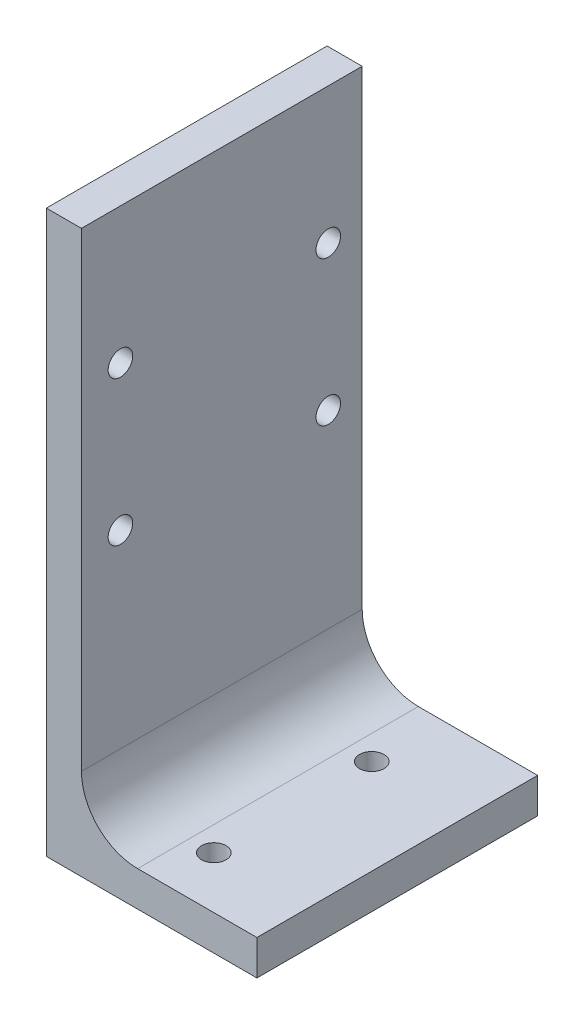
ISO-10303-21;
HEADER;
FILE_DESCRIPTION(('STEP AP214'),'2;1');
FILE_NAME('part.step','',(''),(''),'','','');
FILE_SCHEMA(('AUTOMOTIVE_DESIGN { 1 0 10303 214 1 1 1 1 }'));
ENDSEC;
DATA;
#1=APPLICATION_CONTEXT('core data for automotive mechanical design processes');
#2=APPLICATION_PROTOCOL_DEFINITION('international standard','automotive_design',2000,#1);
#3=PRODUCT_CONTEXT('',#1,'mechanical');
#4=PRODUCT('Part','Part','',(#3));
#5=PRODUCT_RELATED_PRODUCT_CATEGORY('part','',(#4));
#6=PRODUCT_DEFINITION_FORMATION('','',#4);
#7=PRODUCT_DEFINITION_CONTEXT('part definition',#1,'design');
#8=PRODUCT_DEFINITION('design','',#6,#7);
#9=PRODUCT_DEFINITION_SHAPE('','',#8);
#10=(LENGTH_UNIT() NAMED_UNIT(*) SI_UNIT(.MILLI.,.METRE.));
#11=(NAMED_UNIT(*) PLANE_ANGLE_UNIT() SI_UNIT($,.RADIAN.));
#12=(NAMED_UNIT(*) SI_UNIT($,.STERADIAN.) SOLID_ANGLE_UNIT());
#13=UNCERTAINTY_MEASURE_WITH_UNIT(LENGTH_MEASURE(1.E-05),#10,'distance_accuracy_value','');
#14=(GEOMETRIC_REPRESENTATION_CONTEXT(3) GLOBAL_UNCERTAINTY_ASSIGNED_CONTEXT((#13)) GLOBAL_UNIT_ASSIGNED_CONTEXT((#10,
#11,#12)) REPRESENTATION_CONTEXT('',''));
#15=CARTESIAN_POINT('',(0.,0.,0.));
#16=DIRECTION('',(0.,0.,1.));
#17=DIRECTION('',(1.,0.,0.));
#18=AXIS2_PLACEMENT_3D('',#15,#16,#17);
#19=CARTESIAN_POINT('',(0.,-34.9738219895288,40.));
#20=DIRECTION('',(0.,-1.,0.));
#21=DIRECTION('',(0.,0.,-1.));
#22=AXIS2_PLACEMENT_3D('',#19,#20,#21);
#23=PLANE('',#22);
#24=CARTESIAN_POINT('',(-13.5290293124797,-34.9738219895288,32.612904953595));
#25=DIRECTION('',(0.,1.,0.));
#26=DIRECTION('',(0.,0.,1.));
#27=AXIS2_PLACEMENT_3D('',#24,#25,#26);
#28=CIRCLE('',#27,1.74999999999999);
#29=CARTESIAN_POINT('',(-13.5290293124797,-34.9738219895288,34.362904953595));
#30=VERTEX_POINT('',#29);
#31=EDGE_CURVE('E173',#30,#30,#28,.T.);
#32=ORIENTED_EDGE('',*,*,#31,.F.);
#33=EDGE_LOOP('',(#32));
#34=FACE_BOUND('',#33,.T.);
#35=CARTESIAN_POINT('',(-13.5290293124797,-34.9738219895288,10.1107689095841));
#36=DIRECTION('',(0.,1.,0.));
#37=DIRECTION('',(0.,0.,1.));
#38=AXIS2_PLACEMENT_3D('',#35,#36,#37);
#39=CIRCLE('',#38,1.74999999999999);
#40=CARTESIAN_POINT('',(-13.5290293124797,-34.9738219895288,11.8607689095841));
#41=VERTEX_POINT('',#40);
#42=EDGE_CURVE('E167',#41,#41,#39,.T.);
#43=ORIENTED_EDGE('',*,*,#42,.F.);
#44=EDGE_LOOP('',(#43));
#45=FACE_BOUND('',#44,.T.);
#46=DIRECTION('',(-1.,0.,0.));
#47=VECTOR('',#46,1.);
#48=CARTESIAN_POINT('',(0.,-34.9738219895288,0.));
#49=LINE('',#48,#47);
#50=CARTESIAN_POINT('',(0.,-34.9738219895288,0.));
#51=VERTEX_POINT('',#50);
#52=CARTESIAN_POINT('',(-17.,-34.9738219895288,0.));
#53=VERTEX_POINT('',#52);
#54=EDGE_CURVE('E126',#51,#53,#49,.T.);
#55=ORIENTED_EDGE('',*,*,#54,.T.);
#56=DIRECTION('',(0.,0.,-1.));
#57=VECTOR('',#56,1.);
#58=CARTESIAN_POINT('',(-17.,-34.9738219895288,40.));
#59=LINE('',#58,#57);
#60=CARTESIAN_POINT('',(-17.,-34.9738219895288,40.));
#61=VERTEX_POINT('',#60);
#62=EDGE_CURVE('E49',#53,#61,#59,.F.);
#63=ORIENTED_EDGE('',*,*,#62,.T.);
#64=DIRECTION('',(-1.,0.,0.));
#65=VECTOR('',#64,1.);
#66=CARTESIAN_POINT('',(0.,-34.9738219895288,40.));
#67=LINE('',#66,#65);
#68=CARTESIAN_POINT('',(0.,-34.9738219895288,40.));
#69=VERTEX_POINT('',#68);
#70=EDGE_CURVE('E102',#69,#61,#67,.T.);
#71=ORIENTED_EDGE('',*,*,#70,.F.);
#72=DIRECTION('',(0.,0.,-1.));
#73=VECTOR('',#72,1.);
#74=CARTESIAN_POINT('',(0.,-34.9738219895288,40.));
#75=LINE('',#74,#73);
#76=EDGE_CURVE('E125',#69,#51,#75,.T.);
#77=ORIENTED_EDGE('',*,*,#76,.T.);
#78=EDGE_LOOP('',(#55,#63,#71,#77));
#79=FACE_BOUND('',#78,.T.);
#80=ADVANCED_FACE('F34',(#34,#45,#79),#23,.F.);
#81=CARTESIAN_POINT('',(-25.,-34.9738219895288,40.));
#82=DIRECTION('',(-1.,0.,0.));
#83=DIRECTION('',(0.,-1.,0.));
#84=AXIS2_PLACEMENT_3D('',#81,#82,#83);
#85=PLANE('',#84);
#86=CARTESIAN_POINT('',(-25.,20.6350968374664,4.83204436713791));
#87=DIRECTION('',(-1.,0.,0.));
#88=DIRECTION('',(0.,-1.,0.));
#89=AXIS2_PLACEMENT_3D('',#86,#87,#88);
#90=CIRCLE('',#89,1.74999999999999);
#91=CARTESIAN_POINT('',(-25.,18.8850968374665,4.83204436713791));
#92=VERTEX_POINT('',#91);
#93=EDGE_CURVE('E194',#92,#92,#90,.T.);
#94=ORIENTED_EDGE('',*,*,#93,.T.);
#95=EDGE_LOOP('',(#94));
#96=FACE_BOUND('',#95,.T.);
#97=CARTESIAN_POINT('',(-25.,20.6350968374664,34.443923192736));
#98=DIRECTION('',(-1.,0.,0.));
#99=DIRECTION('',(0.,-1.,0.));
#100=AXIS2_PLACEMENT_3D('',#97,#98,#99);
#101=CIRCLE('',#100,1.74999999999999);
#102=CARTESIAN_POINT('',(-25.,18.8850968374665,34.443923192736));
#103=VERTEX_POINT('',#102);
#104=EDGE_CURVE('E188',#103,#103,#101,.T.);
#105=ORIENTED_EDGE('',*,*,#104,.T.);
#106=EDGE_LOOP('',(#105));
#107=FACE_BOUND('',#106,.T.);
#108=CARTESIAN_POINT('',(-25.,0.,34.443923192736));
#109=DIRECTION('',(-1.,0.,0.));
#110=DIRECTION('',(0.,-1.,0.));
#111=AXIS2_PLACEMENT_3D('',#108,#109,#110);
#112=CIRCLE('',#111,1.74999999999999);
#113=CARTESIAN_POINT('',(-25.,-1.74999999999999,34.443923192736));
#114=VERTEX_POINT('',#113);
#115=EDGE_CURVE('E182',#114,#114,#112,.T.);
#116=ORIENTED_EDGE('',*,*,#115,.T.);
#117=EDGE_LOOP('',(#116));
#118=FACE_BOUND('',#117,.T.);
#119=CARTESIAN_POINT('',(-25.,0.,4.83204436713791));
#120=DIRECTION('',(-1.,0.,0.));
#121=DIRECTION('',(0.,-1.,0.));
#122=AXIS2_PLACEMENT_3D('',#119,#120,#121);
#123=CIRCLE('',#122,1.74999999999999);
#124=CARTESIAN_POINT('',(-25.,-1.74999999999999,4.83204436713791));
#125=VERTEX_POINT('',#124);
#126=EDGE_CURVE('E176',#125,#125,#123,.T.);
#127=ORIENTED_EDGE('',*,*,#126,.T.);
#128=EDGE_LOOP('',(#127));
#129=FACE_BOUND('',#128,.T.);
#130=DIRECTION('',(0.,1.,0.));
#131=VECTOR('',#130,1.);
#132=CARTESIAN_POINT('',(-25.,-34.9738219895288,40.));
#133=LINE('',#132,#131);
#134=CARTESIAN_POINT('',(-25.,-26.9738219895288,40.));
#135=VERTEX_POINT('',#134);
#136=CARTESIAN_POINT('',(-25.,40.0261780104712,40.));
#137=VERTEX_POINT('',#136);
#138=EDGE_CURVE('E92',#135,#137,#133,.T.);
#139=ORIENTED_EDGE('',*,*,#138,.F.);
#140=DIRECTION('',(0.,0.,-1.));
#141=VECTOR('',#140,1.);
#142=CARTESIAN_POINT('',(-25.,-26.9738219895288,0.));
#143=LINE('',#142,#141);
#144=CARTESIAN_POINT('',(-25.,-26.9738219895288,0.));
#145=VERTEX_POINT('',#144);
#146=EDGE_CURVE('E110',#135,#145,#143,.T.);
#147=ORIENTED_EDGE('',*,*,#146,.T.);
#148=DIRECTION('',(0.,1.,0.));
#149=VECTOR('',#148,1.);
#150=CARTESIAN_POINT('',(-25.,-34.9738219895288,0.));
#151=LINE('',#150,#149);
#152=CARTESIAN_POINT('',(-25.,40.0261780104712,0.));
#153=VERTEX_POINT('',#152);
#154=EDGE_CURVE('E107',#145,#153,#151,.T.);
#155=ORIENTED_EDGE('',*,*,#154,.T.);
#156=DIRECTION('',(0.,0.,-1.));
#157=VECTOR('',#156,1.);
#158=CARTESIAN_POINT('',(-25.,40.0261780104712,40.));
#159=LINE('',#158,#157);
#160=EDGE_CURVE('E105',#137,#153,#159,.T.);
#161=ORIENTED_EDGE('',*,*,#160,.F.);
#162=EDGE_LOOP('',(#139,#147,#155,#161));
#163=FACE_BOUND('',#162,.T.);
#164=ADVANCED_FACE('F106',(#96,#107,#118,#129,#163),#85,.F.);
#165=CARTESIAN_POINT('',(-25.,40.0261780104712,40.));
#166=DIRECTION('',(0.,-1.,0.));
#167=DIRECTION('',(0.,0.,-1.));
#168=AXIS2_PLACEMENT_3D('',#165,#166,#167);
#169=PLANE('',#168);
#170=DIRECTION('',(-1.,0.,0.));
#171=VECTOR('',#170,1.);
#172=CARTESIAN_POINT('',(-25.,40.0261780104712,0.));
#173=LINE('',#172,#171);
#174=CARTESIAN_POINT('',(-30.,40.0261780104712,0.));
#175=VERTEX_POINT('',#174);
#176=EDGE_CURVE('E130',#153,#175,#173,.T.);
#177=ORIENTED_EDGE('',*,*,#176,.T.);
#178=DIRECTION('',(0.,0.,-1.));
#179=VECTOR('',#178,1.);
#180=CARTESIAN_POINT('',(-30.,40.0261780104712,40.));
#181=LINE('',#180,#179);
#182=CARTESIAN_POINT('',(-30.,40.0261780104712,40.));
#183=VERTEX_POINT('',#182);
#184=EDGE_CURVE('E111',#183,#175,#181,.T.);
#185=ORIENTED_EDGE('',*,*,#184,.F.);
#186=DIRECTION('',(-1.,0.,0.));
#187=VECTOR('',#186,1.);
#188=CARTESIAN_POINT('',(-25.,40.0261780104712,40.));
#189=LINE('',#188,#187);
#190=EDGE_CURVE('E96',#137,#183,#189,.T.);
#191=ORIENTED_EDGE('',*,*,#190,.F.);
#192=ORIENTED_EDGE('',*,*,#160,.T.);
#193=EDGE_LOOP('',(#177,#185,#191,#192));
#194=FACE_BOUND('',#193,.T.);
#195=ADVANCED_FACE('F113',(#194),#169,.F.);
#196=CARTESIAN_POINT('',(-30.,40.0261780104712,40.));
#197=DIRECTION('',(1.,0.,0.));
#198=DIRECTION('',(0.,1.,0.));
#199=AXIS2_PLACEMENT_3D('',#196,#197,#198);
#200=PLANE('',#199);
#201=CARTESIAN_POINT('',(-30.,20.6350968374664,4.83204436713791));
#202=DIRECTION('',(-1.,0.,0.));
#203=DIRECTION('',(0.,0.,1.));
#204=AXIS2_PLACEMENT_3D('',#201,#202,#203);
#205=CIRCLE('',#204,1.74999999999999);
#206=CARTESIAN_POINT('',(-30.,20.6350968374664,6.5820443671379));
#207=VERTEX_POINT('',#206);
#208=EDGE_CURVE('E197',#207,#207,#205,.T.);
#209=ORIENTED_EDGE('',*,*,#208,.F.);
#210=EDGE_LOOP('',(#209));
#211=FACE_BOUND('',#210,.T.);
#212=CARTESIAN_POINT('',(-30.,20.6350968374664,34.443923192736));
#213=DIRECTION('',(-1.,0.,0.));
#214=DIRECTION('',(0.,0.,1.));
#215=AXIS2_PLACEMENT_3D('',#212,#213,#214);
#216=CIRCLE('',#215,1.74999999999999);
#217=CARTESIAN_POINT('',(-30.,20.6350968374664,36.193923192736));
#218=VERTEX_POINT('',#217);
#219=EDGE_CURVE('E191',#218,#218,#216,.T.);
#220=ORIENTED_EDGE('',*,*,#219,.F.);
#221=EDGE_LOOP('',(#220));
#222=FACE_BOUND('',#221,.T.);
#223=CARTESIAN_POINT('',(-30.,0.,34.443923192736));
#224=DIRECTION('',(-1.,0.,0.));
#225=DIRECTION('',(0.,0.,1.));
#226=AXIS2_PLACEMENT_3D('',#223,#224,#225);
#227=CIRCLE('',#226,1.74999999999999);
#228=CARTESIAN_POINT('',(-30.,0.,36.193923192736));
#229=VERTEX_POINT('',#228);
#230=EDGE_CURVE('E185',#229,#229,#227,.T.);
#231=ORIENTED_EDGE('',*,*,#230,.F.);
#232=EDGE_LOOP('',(#231));
#233=FACE_BOUND('',#232,.T.);
#234=CARTESIAN_POINT('',(-30.,0.,4.83204436713791));
#235=DIRECTION('',(-1.,0.,0.));
#236=DIRECTION('',(0.,0.,1.));
#237=AXIS2_PLACEMENT_3D('',#234,#235,#236);
#238=CIRCLE('',#237,1.74999999999999);
#239=CARTESIAN_POINT('',(-30.,0.,6.5820443671379));
#240=VERTEX_POINT('',#239);
#241=EDGE_CURVE('E179',#240,#240,#238,.T.);
#242=ORIENTED_EDGE('',*,*,#241,.F.);
#243=EDGE_LOOP('',(#242));
#244=FACE_BOUND('',#243,.T.);
#245=DIRECTION('',(0.,-1.,0.));
#246=VECTOR('',#245,1.);
#247=CARTESIAN_POINT('',(-30.,40.0261780104712,0.));
#248=LINE('',#247,#246);
#249=CARTESIAN_POINT('',(-30.,-39.9738219895288,0.));
#250=VERTEX_POINT('',#249);
#251=EDGE_CURVE('E132',#175,#250,#248,.T.);
#252=ORIENTED_EDGE('',*,*,#251,.T.);
#253=DIRECTION('',(0.,0.,-1.));
#254=VECTOR('',#253,1.);
#255=CARTESIAN_POINT('',(-30.,-39.9738219895288,40.));
#256=LINE('',#255,#254);
#257=CARTESIAN_POINT('',(-30.,-39.9738219895288,40.));
#258=VERTEX_POINT('',#257);
#259=EDGE_CURVE('E143',#258,#250,#256,.T.);
#260=ORIENTED_EDGE('',*,*,#259,.F.);
#261=DIRECTION('',(0.,-1.,0.));
#262=VECTOR('',#261,1.);
#263=CARTESIAN_POINT('',(-30.,40.0261780104712,40.));
#264=LINE('',#263,#262);
#265=EDGE_CURVE('E116',#183,#258,#264,.T.);
#266=ORIENTED_EDGE('',*,*,#265,.F.);
#267=ORIENTED_EDGE('',*,*,#184,.T.);
#268=EDGE_LOOP('',(#252,#260,#266,#267));
#269=FACE_BOUND('',#268,.T.);
#270=ADVANCED_FACE('F153',(#211,#222,#233,#244,#269),#200,.F.);
#271=CARTESIAN_POINT('',(-30.,-39.9738219895288,40.));
#272=DIRECTION('',(0.,1.,0.));
#273=DIRECTION('',(0.,0.,1.));
#274=AXIS2_PLACEMENT_3D('',#271,#272,#273);
#275=PLANE('',#274);
#276=CARTESIAN_POINT('',(-13.5290293124797,-39.9738219895288,32.612904953595));
#277=DIRECTION('',(0.,1.,0.));
#278=DIRECTION('',(0.,0.,1.));
#279=AXIS2_PLACEMENT_3D('',#276,#277,#278);
#280=CIRCLE('',#279,1.74999999999999);
#281=CARTESIAN_POINT('',(-13.5290293124797,-39.9738219895288,34.362904953595));
#282=VERTEX_POINT('',#281);
#283=EDGE_CURVE('E170',#282,#282,#280,.T.);
#284=ORIENTED_EDGE('',*,*,#283,.T.);
#285=EDGE_LOOP('',(#284));
#286=FACE_BOUND('',#285,.T.);
#287=CARTESIAN_POINT('',(-13.5290293124797,-39.9738219895288,10.1107689095841));
#288=DIRECTION('',(0.,1.,0.));
#289=DIRECTION('',(0.,0.,1.));
#290=AXIS2_PLACEMENT_3D('',#287,#288,#289);
#291=CIRCLE('',#290,1.74999999999999);
#292=CARTESIAN_POINT('',(-13.5290293124797,-39.9738219895288,11.8607689095841));
#293=VERTEX_POINT('',#292);
#294=EDGE_CURVE('E128',#293,#293,#291,.T.);
#295=ORIENTED_EDGE('',*,*,#294,.T.);
#296=EDGE_LOOP('',(#295));
#297=FACE_BOUND('',#296,.T.);
#298=DIRECTION('',(1.,0.,0.));
#299=VECTOR('',#298,1.);
#300=CARTESIAN_POINT('',(-30.,-39.9738219895288,0.));
#301=LINE('',#300,#299);
#302=CARTESIAN_POINT('',(0.,-39.9738219895288,0.));
#303=VERTEX_POINT('',#302);
#304=EDGE_CURVE('E134',#250,#303,#301,.T.);
#305=ORIENTED_EDGE('',*,*,#304,.T.);
#306=DIRECTION('',(0.,0.,-1.));
#307=VECTOR('',#306,1.);
#308=CARTESIAN_POINT('',(0.,-39.9738219895288,40.));
#309=LINE('',#308,#307);
#310=CARTESIAN_POINT('',(0.,-39.9738219895288,40.));
#311=VERTEX_POINT('',#310);
#312=EDGE_CURVE('E140',#311,#303,#309,.T.);
#313=ORIENTED_EDGE('',*,*,#312,.F.);
#314=DIRECTION('',(1.,0.,0.));
#315=VECTOR('',#314,1.);
#316=CARTESIAN_POINT('',(-30.,-39.9738219895288,40.));
#317=LINE('',#316,#315);
#318=EDGE_CURVE('E118',#258,#311,#317,.T.);
#319=ORIENTED_EDGE('',*,*,#318,.F.);
#320=ORIENTED_EDGE('',*,*,#259,.T.);
#321=EDGE_LOOP('',(#305,#313,#319,#320));
#322=FACE_BOUND('',#321,.T.);
#323=ADVANCED_FACE('F160',(#286,#297,#322),#275,.F.);
#324=CARTESIAN_POINT('',(0.,-39.9738219895288,40.));
#325=DIRECTION('',(-1.,0.,0.));
#326=DIRECTION('',(0.,0.,1.));
#327=AXIS2_PLACEMENT_3D('',#324,#325,#326);
#328=PLANE('',#327);
#329=DIRECTION('',(0.,1.,0.));
#330=VECTOR('',#329,1.);
#331=CARTESIAN_POINT('',(0.,-39.9738219895288,0.));
#332=LINE('',#331,#330);
#333=EDGE_CURVE('E136',#303,#51,#332,.T.);
#334=ORIENTED_EDGE('',*,*,#333,.T.);
#335=ORIENTED_EDGE('',*,*,#76,.F.);
#336=DIRECTION('',(0.,1.,0.));
#337=VECTOR('',#336,1.);
#338=CARTESIAN_POINT('',(0.,-39.9738219895288,40.));
#339=LINE('',#338,#337);
#340=EDGE_CURVE('E123',#311,#69,#339,.T.);
#341=ORIENTED_EDGE('',*,*,#340,.F.);
#342=ORIENTED_EDGE('',*,*,#312,.T.);
#343=EDGE_LOOP('',(#334,#335,#341,#342));
#344=FACE_BOUND('',#343,.T.);
#345=ADVANCED_FACE('F163',(#344),#328,.F.);
#346=CARTESIAN_POINT('',(0.,0.,40.));
#347=DIRECTION('',(0.,0.,-1.));
#348=DIRECTION('',(-1.,0.,0.));
#349=AXIS2_PLACEMENT_3D('',#346,#347,#348);
#350=PLANE('',#349);
#351=ORIENTED_EDGE('',*,*,#70,.T.);
#352=CARTESIAN_POINT('',(-17.,-26.9738219895288,40.));
#353=DIRECTION('',(0.,0.,-1.));
#354=DIRECTION('',(-1.,0.,0.));
#355=AXIS2_PLACEMENT_3D('',#352,#353,#354);
#356=CIRCLE('',#355,8.);
#357=EDGE_CURVE('E11',#61,#135,#356,.T.);
#358=ORIENTED_EDGE('',*,*,#357,.T.);
#359=ORIENTED_EDGE('',*,*,#138,.T.);
#360=ORIENTED_EDGE('',*,*,#190,.T.);
#361=ORIENTED_EDGE('',*,*,#265,.T.);
#362=ORIENTED_EDGE('',*,*,#318,.T.);
#363=ORIENTED_EDGE('',*,*,#340,.T.);
#364=EDGE_LOOP('',(#351,#358,#359,#360,#361,#362,#363));
#365=FACE_BOUND('',#364,.T.);
#366=ADVANCED_FACE('F94',(#365),#350,.F.);
#367=CARTESIAN_POINT('',(0.,0.,0.));
#368=DIRECTION('',(0.,0.,-1.));
#369=DIRECTION('',(-1.,0.,0.));
#370=AXIS2_PLACEMENT_3D('',#367,#368,#369);
#371=PLANE('',#370);
#372=ORIENTED_EDGE('',*,*,#54,.F.);
#373=ORIENTED_EDGE('',*,*,#333,.F.);
#374=ORIENTED_EDGE('',*,*,#304,.F.);
#375=ORIENTED_EDGE('',*,*,#251,.F.);
#376=ORIENTED_EDGE('',*,*,#176,.F.);
#377=ORIENTED_EDGE('',*,*,#154,.F.);
#378=CARTESIAN_POINT('',(-17.,-26.9738219895288,0.));
#379=DIRECTION('',(0.,0.,-1.));
#380=DIRECTION('',(-1.,0.,0.));
#381=AXIS2_PLACEMENT_3D('',#378,#379,#380);
#382=CIRCLE('',#381,8.);
#383=EDGE_CURVE('E42',#145,#53,#382,.F.);
#384=ORIENTED_EDGE('',*,*,#383,.T.);
#385=EDGE_LOOP('',(#372,#373,#374,#375,#376,#377,#384));
#386=FACE_BOUND('',#385,.T.);
#387=ADVANCED_FACE('F149',(#386),#371,.T.);
#388=CARTESIAN_POINT('',(-13.5290293124797,-34.9738219895288,10.1107689095841));
#389=DIRECTION('',(0.,1.,0.));
#390=DIRECTION('',(0.,0.,1.));
#391=AXIS2_PLACEMENT_3D('',#388,#389,#390);
#392=CYLINDRICAL_SURFACE('',#391,1.74999999999999);
#393=ORIENTED_EDGE('',*,*,#42,.T.);
#394=EDGE_LOOP('',(#393));
#395=FACE_BOUND('',#394,.T.);
#396=ORIENTED_EDGE('',*,*,#294,.F.);
#397=EDGE_LOOP('',(#396));
#398=FACE_BOUND('',#397,.T.);
#399=ADVANCED_FACE('F239',(#395,#398),#392,.F.);
#400=CARTESIAN_POINT('',(-13.5290293124797,-34.9738219895288,32.612904953595));
#401=DIRECTION('',(0.,1.,0.));
#402=DIRECTION('',(0.,0.,1.));
#403=AXIS2_PLACEMENT_3D('',#400,#401,#402);
#404=CYLINDRICAL_SURFACE('',#403,1.74999999999999);
#405=ORIENTED_EDGE('',*,*,#31,.T.);
#406=EDGE_LOOP('',(#405));
#407=FACE_BOUND('',#406,.T.);
#408=ORIENTED_EDGE('',*,*,#283,.F.);
#409=EDGE_LOOP('',(#408));
#410=FACE_BOUND('',#409,.T.);
#411=ADVANCED_FACE('F217',(#407,#410),#404,.F.);
#412=CARTESIAN_POINT('',(-30.,0.,4.83204436713791));
#413=DIRECTION('',(-1.,0.,0.));
#414=DIRECTION('',(0.,0.,1.));
#415=AXIS2_PLACEMENT_3D('',#412,#413,#414);
#416=CYLINDRICAL_SURFACE('',#415,1.74999999999999);
#417=ORIENTED_EDGE('',*,*,#241,.T.);
#418=EDGE_LOOP('',(#417));
#419=FACE_BOUND('',#418,.T.);
#420=ORIENTED_EDGE('',*,*,#126,.F.);
#421=EDGE_LOOP('',(#420));
#422=FACE_BOUND('',#421,.T.);
#423=ADVANCED_FACE('F213',(#419,#422),#416,.F.);
#424=CARTESIAN_POINT('',(-30.,0.,34.443923192736));
#425=DIRECTION('',(-1.,0.,0.));
#426=DIRECTION('',(0.,0.,1.));
#427=AXIS2_PLACEMENT_3D('',#424,#425,#426);
#428=CYLINDRICAL_SURFACE('',#427,1.74999999999999);
#429=ORIENTED_EDGE('',*,*,#230,.T.);
#430=EDGE_LOOP('',(#429));
#431=FACE_BOUND('',#430,.T.);
#432=ORIENTED_EDGE('',*,*,#115,.F.);
#433=EDGE_LOOP('',(#432));
#434=FACE_BOUND('',#433,.T.);
#435=ADVANCED_FACE('F216',(#431,#434),#428,.F.);
#436=CARTESIAN_POINT('',(-30.,20.6350968374664,34.443923192736));
#437=DIRECTION('',(-1.,0.,0.));
#438=DIRECTION('',(0.,0.,1.));
#439=AXIS2_PLACEMENT_3D('',#436,#437,#438);
#440=CYLINDRICAL_SURFACE('',#439,1.74999999999999);
#441=ORIENTED_EDGE('',*,*,#219,.T.);
#442=EDGE_LOOP('',(#441));
#443=FACE_BOUND('',#442,.T.);
#444=ORIENTED_EDGE('',*,*,#104,.F.);
#445=EDGE_LOOP('',(#444));
#446=FACE_BOUND('',#445,.T.);
#447=ADVANCED_FACE('F250',(#443,#446),#440,.F.);
#448=CARTESIAN_POINT('',(-30.,20.6350968374664,4.83204436713791));
#449=DIRECTION('',(-1.,0.,0.));
#450=DIRECTION('',(0.,0.,1.));
#451=AXIS2_PLACEMENT_3D('',#448,#449,#450);
#452=CYLINDRICAL_SURFACE('',#451,1.74999999999999);
#453=ORIENTED_EDGE('',*,*,#208,.T.);
#454=EDGE_LOOP('',(#453));
#455=FACE_BOUND('',#454,.T.);
#456=ORIENTED_EDGE('',*,*,#93,.F.);
#457=EDGE_LOOP('',(#456));
#458=FACE_BOUND('',#457,.T.);
#459=ADVANCED_FACE('F201',(#455,#458),#452,.F.);
#460=CARTESIAN_POINT('',(-17.,-26.9738219895288,40.));
#461=DIRECTION('',(0.,0.,1.));
#462=DIRECTION('',(1.,0.,0.));
#463=AXIS2_PLACEMENT_3D('',#460,#461,#462);
#464=CYLINDRICAL_SURFACE('',#463,8.);
#465=ORIENTED_EDGE('',*,*,#357,.F.);
#466=ORIENTED_EDGE('',*,*,#62,.F.);
#467=ORIENTED_EDGE('',*,*,#383,.F.);
#468=ORIENTED_EDGE('',*,*,#146,.F.);
#469=EDGE_LOOP('',(#465,#466,#467,#468));
#470=FACE_BOUND('',#469,.T.);
#471=ADVANCED_FACE('F36',(#470),#464,.F.);
#472=CLOSED_SHELL('',(#80,#164,#195,#270,#323,#345,#366,#387,#399,#411,#423,#435,#447,#459,#471));
#473=MANIFOLD_SOLID_BREP('B2',#472);
#474=ADVANCED_BREP_SHAPE_REPRESENTATION('',(#18,#473),#14);
#475=SHAPE_DEFINITION_REPRESENTATION(#9,#474);
ENDSEC;
END-ISO-10303-21;
